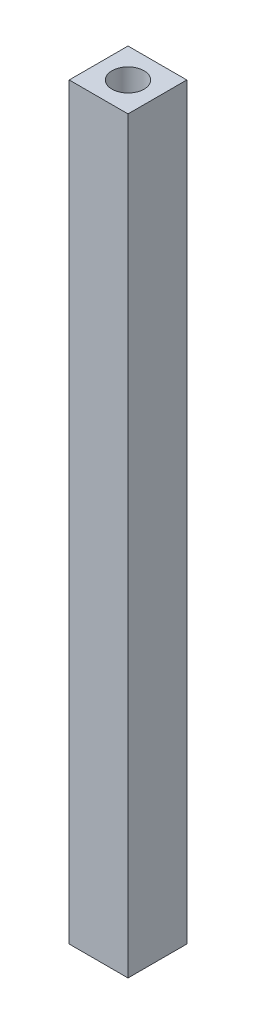
ISO-10303-21;
HEADER;
FILE_DESCRIPTION(('STEP AP214'),'2;1');
FILE_NAME('part.step','',(''),(''),'','','');
FILE_SCHEMA(('AUTOMOTIVE_DESIGN { 1 0 10303 214 1 1 1 1 }'));
ENDSEC;
DATA;
#1=APPLICATION_CONTEXT('core data for automotive mechanical design processes');
#2=APPLICATION_PROTOCOL_DEFINITION('international standard','automotive_design',2000,#1);
#3=PRODUCT_CONTEXT('',#1,'mechanical');
#4=PRODUCT('Part','Part','',(#3));
#5=PRODUCT_RELATED_PRODUCT_CATEGORY('part','',(#4));
#6=PRODUCT_DEFINITION_FORMATION('','',#4);
#7=PRODUCT_DEFINITION_CONTEXT('part definition',#1,'design');
#8=PRODUCT_DEFINITION('design','',#6,#7);
#9=PRODUCT_DEFINITION_SHAPE('','',#8);
#10=(LENGTH_UNIT() NAMED_UNIT(*) SI_UNIT(.MILLI.,.METRE.));
#11=(NAMED_UNIT(*) PLANE_ANGLE_UNIT() SI_UNIT($,.RADIAN.));
#12=(NAMED_UNIT(*) SI_UNIT($,.STERADIAN.) SOLID_ANGLE_UNIT());
#13=UNCERTAINTY_MEASURE_WITH_UNIT(LENGTH_MEASURE(1.E-05),#10,'distance_accuracy_value','');
#14=(GEOMETRIC_REPRESENTATION_CONTEXT(3) GLOBAL_UNCERTAINTY_ASSIGNED_CONTEXT((#13)) GLOBAL_UNIT_ASSIGNED_CONTEXT((#10,
#11,#12)) REPRESENTATION_CONTEXT('',''));
#15=CARTESIAN_POINT('',(0.,0.,0.));
#16=DIRECTION('',(0.,0.,1.));
#17=DIRECTION('',(1.,0.,0.));
#18=AXIS2_PLACEMENT_3D('',#15,#16,#17);
#19=CARTESIAN_POINT('',(2.75,35.,-2.75));
#20=DIRECTION('',(-1.,0.,0.));
#21=DIRECTION('',(0.,0.,1.));
#22=AXIS2_PLACEMENT_3D('',#19,#20,#21);
#23=PLANE('',#22);
#24=DIRECTION('',(0.,0.,-1.));
#25=VECTOR('',#24,1.);
#26=CARTESIAN_POINT('',(2.75,-35.,-2.75));
#27=LINE('',#26,#25);
#28=CARTESIAN_POINT('',(2.75,-35.,2.75));
#29=VERTEX_POINT('',#28);
#30=CARTESIAN_POINT('',(2.75,-35.,-2.75));
#31=VERTEX_POINT('',#30);
#32=EDGE_CURVE('E97',#29,#31,#27,.T.);
#33=ORIENTED_EDGE('',*,*,#32,.T.);
#34=DIRECTION('',(0.,-1.,0.));
#35=VECTOR('',#34,1.);
#36=CARTESIAN_POINT('',(2.75,35.,-2.75));
#37=LINE('',#36,#35);
#38=CARTESIAN_POINT('',(2.75,35.,-2.75));
#39=VERTEX_POINT('',#38);
#40=EDGE_CURVE('E11',#39,#31,#37,.T.);
#41=ORIENTED_EDGE('',*,*,#40,.F.);
#42=DIRECTION('',(0.,0.,-1.));
#43=VECTOR('',#42,1.);
#44=CARTESIAN_POINT('',(2.75,35.,-2.75));
#45=LINE('',#44,#43);
#46=CARTESIAN_POINT('',(2.75,35.,2.75));
#47=VERTEX_POINT('',#46);
#48=EDGE_CURVE('E85',#47,#39,#45,.T.);
#49=ORIENTED_EDGE('',*,*,#48,.F.);
#50=DIRECTION('',(0.,-1.,0.));
#51=VECTOR('',#50,1.);
#52=CARTESIAN_POINT('',(2.75,35.,2.75));
#53=LINE('',#52,#51);
#54=EDGE_CURVE('E93',#47,#29,#53,.T.);
#55=ORIENTED_EDGE('',*,*,#54,.T.);
#56=EDGE_LOOP('',(#33,#41,#49,#55));
#57=FACE_BOUND('',#56,.T.);
#58=ADVANCED_FACE('F34',(#57),#23,.F.);
#59=CARTESIAN_POINT('',(-2.75,35.,-2.75));
#60=DIRECTION('',(0.,0.,1.));
#61=DIRECTION('',(1.,0.,0.));
#62=AXIS2_PLACEMENT_3D('',#59,#60,#61);
#63=PLANE('',#62);
#64=DIRECTION('',(-1.,0.,0.));
#65=VECTOR('',#64,1.);
#66=CARTESIAN_POINT('',(-2.75,-35.,-2.75));
#67=LINE('',#66,#65);
#68=CARTESIAN_POINT('',(-2.75,-35.,-2.75));
#69=VERTEX_POINT('',#68);
#70=EDGE_CURVE('E89',#31,#69,#67,.T.);
#71=ORIENTED_EDGE('',*,*,#70,.T.);
#72=DIRECTION('',(0.,-1.,0.));
#73=VECTOR('',#72,1.);
#74=CARTESIAN_POINT('',(-2.75,35.,-2.75));
#75=LINE('',#74,#73);
#76=CARTESIAN_POINT('',(-2.75,35.,-2.75));
#77=VERTEX_POINT('',#76);
#78=EDGE_CURVE('E42',#77,#69,#75,.T.);
#79=ORIENTED_EDGE('',*,*,#78,.F.);
#80=DIRECTION('',(-1.,0.,0.));
#81=VECTOR('',#80,1.);
#82=CARTESIAN_POINT('',(-2.75,35.,-2.75));
#83=LINE('',#82,#81);
#84=EDGE_CURVE('E80',#39,#77,#83,.T.);
#85=ORIENTED_EDGE('',*,*,#84,.F.);
#86=ORIENTED_EDGE('',*,*,#40,.T.);
#87=EDGE_LOOP('',(#71,#79,#85,#86));
#88=FACE_BOUND('',#87,.T.);
#89=ADVANCED_FACE('F88',(#88),#63,.F.);
#90=CARTESIAN_POINT('',(-2.75,35.,-2.75));
#91=DIRECTION('',(1.,0.,0.));
#92=DIRECTION('',(0.,0.,-1.));
#93=AXIS2_PLACEMENT_3D('',#90,#91,#92);
#94=PLANE('',#93);
#95=DIRECTION('',(0.,0.,1.));
#96=VECTOR('',#95,1.);
#97=CARTESIAN_POINT('',(-2.75,-35.,-2.75));
#98=LINE('',#97,#96);
#99=CARTESIAN_POINT('',(-2.75,-35.,2.75));
#100=VERTEX_POINT('',#99);
#101=EDGE_CURVE('E67',#69,#100,#98,.T.);
#102=ORIENTED_EDGE('',*,*,#101,.T.);
#103=DIRECTION('',(0.,-1.,0.));
#104=VECTOR('',#103,1.);
#105=CARTESIAN_POINT('',(-2.75,35.,2.75));
#106=LINE('',#105,#104);
#107=CARTESIAN_POINT('',(-2.75,35.,2.75));
#108=VERTEX_POINT('',#107);
#109=EDGE_CURVE('E90',#108,#100,#106,.T.);
#110=ORIENTED_EDGE('',*,*,#109,.F.);
#111=DIRECTION('',(0.,0.,1.));
#112=VECTOR('',#111,1.);
#113=CARTESIAN_POINT('',(-2.75,35.,-2.75));
#114=LINE('',#113,#112);
#115=EDGE_CURVE('E83',#77,#108,#114,.T.);
#116=ORIENTED_EDGE('',*,*,#115,.F.);
#117=ORIENTED_EDGE('',*,*,#78,.T.);
#118=EDGE_LOOP('',(#102,#110,#116,#117));
#119=FACE_BOUND('',#118,.T.);
#120=ADVANCED_FACE('F91',(#119),#94,.F.);
#121=CARTESIAN_POINT('',(-2.75,35.,2.75));
#122=DIRECTION('',(0.,0.,-1.));
#123=DIRECTION('',(-1.,0.,0.));
#124=AXIS2_PLACEMENT_3D('',#121,#122,#123);
#125=PLANE('',#124);
#126=DIRECTION('',(1.,0.,0.));
#127=VECTOR('',#126,1.);
#128=CARTESIAN_POINT('',(-2.75,-35.,2.75));
#129=LINE('',#128,#127);
#130=EDGE_CURVE('E73',#100,#29,#129,.T.);
#131=ORIENTED_EDGE('',*,*,#130,.T.);
#132=ORIENTED_EDGE('',*,*,#54,.F.);
#133=DIRECTION('',(1.,0.,0.));
#134=VECTOR('',#133,1.);
#135=CARTESIAN_POINT('',(-2.75,35.,2.75));
#136=LINE('',#135,#134);
#137=EDGE_CURVE('E50',#108,#47,#136,.T.);
#138=ORIENTED_EDGE('',*,*,#137,.F.);
#139=ORIENTED_EDGE('',*,*,#109,.T.);
#140=EDGE_LOOP('',(#131,#132,#138,#139));
#141=FACE_BOUND('',#140,.T.);
#142=ADVANCED_FACE('F105',(#141),#125,.F.);
#143=CARTESIAN_POINT('',(0.,35.,0.));
#144=DIRECTION('',(0.,1.,0.));
#145=DIRECTION('',(0.,0.,1.));
#146=AXIS2_PLACEMENT_3D('',#143,#144,#145);
#147=PLANE('',#146);
#148=CARTESIAN_POINT('',(0.,35.,0.));
#149=DIRECTION('',(0.,1.,0.));
#150=DIRECTION('',(0.,0.,1.));
#151=AXIS2_PLACEMENT_3D('',#148,#149,#150);
#152=CIRCLE('',#151,1.5);
#153=CARTESIAN_POINT('',(0.,35.,1.5));
#154=VERTEX_POINT('',#153);
#155=EDGE_CURVE('E111',#154,#154,#152,.T.);
#156=ORIENTED_EDGE('',*,*,#155,.F.);
#157=EDGE_LOOP('',(#156));
#158=FACE_BOUND('',#157,.T.);
#159=ORIENTED_EDGE('',*,*,#48,.T.);
#160=ORIENTED_EDGE('',*,*,#84,.T.);
#161=ORIENTED_EDGE('',*,*,#115,.T.);
#162=ORIENTED_EDGE('',*,*,#137,.T.);
#163=EDGE_LOOP('',(#159,#160,#161,#162));
#164=FACE_BOUND('',#163,.T.);
#165=ADVANCED_FACE('F81',(#158,#164),#147,.T.);
#166=CARTESIAN_POINT('',(0.,-35.,0.));
#167=DIRECTION('',(0.,1.,0.));
#168=DIRECTION('',(0.,0.,1.));
#169=AXIS2_PLACEMENT_3D('',#166,#167,#168);
#170=PLANE('',#169);
#171=CARTESIAN_POINT('',(0.,-35.,0.));
#172=DIRECTION('',(0.,1.,0.));
#173=DIRECTION('',(0.,0.,1.));
#174=AXIS2_PLACEMENT_3D('',#171,#172,#173);
#175=CIRCLE('',#174,1.5);
#176=CARTESIAN_POINT('',(0.,-35.,1.5));
#177=VERTEX_POINT('',#176);
#178=EDGE_CURVE('E117',#177,#177,#175,.T.);
#179=ORIENTED_EDGE('',*,*,#178,.T.);
#180=EDGE_LOOP('',(#179));
#181=FACE_BOUND('',#180,.T.);
#182=ORIENTED_EDGE('',*,*,#32,.F.);
#183=ORIENTED_EDGE('',*,*,#130,.F.);
#184=ORIENTED_EDGE('',*,*,#101,.F.);
#185=ORIENTED_EDGE('',*,*,#70,.F.);
#186=EDGE_LOOP('',(#182,#183,#184,#185));
#187=FACE_BOUND('',#186,.T.);
#188=ADVANCED_FACE('F108',(#181,#187),#170,.F.);
#189=CARTESIAN_POINT('',(0.,25.,0.));
#190=DIRECTION('',(0.,1.,0.));
#191=DIRECTION('',(0.,0.,1.));
#192=AXIS2_PLACEMENT_3D('',#189,#190,#191);
#193=CYLINDRICAL_SURFACE('',#192,1.5);
#194=CARTESIAN_POINT('',(0.,25.,0.));
#195=DIRECTION('',(0.,1.,0.));
#196=DIRECTION('',(0.,0.,1.));
#197=AXIS2_PLACEMENT_3D('',#194,#195,#196);
#198=CIRCLE('',#197,1.5);
#199=CARTESIAN_POINT('',(0.,25.,1.5));
#200=VERTEX_POINT('',#199);
#201=EDGE_CURVE('E100',#200,#200,#198,.T.);
#202=ORIENTED_EDGE('',*,*,#201,.F.);
#203=EDGE_LOOP('',(#202));
#204=FACE_BOUND('',#203,.T.);
#205=ORIENTED_EDGE('',*,*,#155,.T.);
#206=EDGE_LOOP('',(#205));
#207=FACE_BOUND('',#206,.T.);
#208=ADVANCED_FACE('F147',(#204,#207),#193,.F.);
#209=CARTESIAN_POINT('',(0.,25.,0.));
#210=DIRECTION('',(0.,1.,0.));
#211=DIRECTION('',(0.,0.,1.));
#212=AXIS2_PLACEMENT_3D('',#209,#210,#211);
#213=PLANE('',#212);
#214=ORIENTED_EDGE('',*,*,#201,.T.);
#215=EDGE_LOOP('',(#214));
#216=FACE_BOUND('',#215,.T.);
#217=ADVANCED_FACE('F132',(#216),#213,.T.);
#218=CARTESIAN_POINT('',(0.,-25.,0.));
#219=DIRECTION('',(0.,-1.,0.));
#220=DIRECTION('',(0.,0.,-1.));
#221=AXIS2_PLACEMENT_3D('',#218,#219,#220);
#222=CYLINDRICAL_SURFACE('',#221,1.5);
#223=CARTESIAN_POINT('',(0.,-25.,0.));
#224=DIRECTION('',(0.,1.,0.));
#225=DIRECTION('',(0.,0.,1.));
#226=AXIS2_PLACEMENT_3D('',#223,#224,#225);
#227=CIRCLE('',#226,1.5);
#228=CARTESIAN_POINT('',(0.,-25.,1.5));
#229=VERTEX_POINT('',#228);
#230=EDGE_CURVE('E114',#229,#229,#227,.T.);
#231=ORIENTED_EDGE('',*,*,#230,.T.);
#232=EDGE_LOOP('',(#231));
#233=FACE_BOUND('',#232,.T.);
#234=ORIENTED_EDGE('',*,*,#178,.F.);
#235=EDGE_LOOP('',(#234));
#236=FACE_BOUND('',#235,.T.);
#237=ADVANCED_FACE('F123',(#233,#236),#222,.F.);
#238=CARTESIAN_POINT('',(0.,-25.,0.));
#239=DIRECTION('',(0.,-1.,0.));
#240=DIRECTION('',(0.,0.,1.));
#241=AXIS2_PLACEMENT_3D('',#238,#239,#240);
#242=PLANE('',#241);
#243=ORIENTED_EDGE('',*,*,#230,.F.);
#244=EDGE_LOOP('',(#243));
#245=FACE_BOUND('',#244,.T.);
#246=ADVANCED_FACE('F126',(#245),#242,.T.);
#247=CLOSED_SHELL('',(#58,#89,#120,#142,#165,#188,#208,#217,#237,#246));
#248=MANIFOLD_SOLID_BREP('B2',#247);
#249=ADVANCED_BREP_SHAPE_REPRESENTATION('',(#18,#248),#14);
#250=SHAPE_DEFINITION_REPRESENTATION(#9,#249);
ENDSEC;
END-ISO-10303-21;
